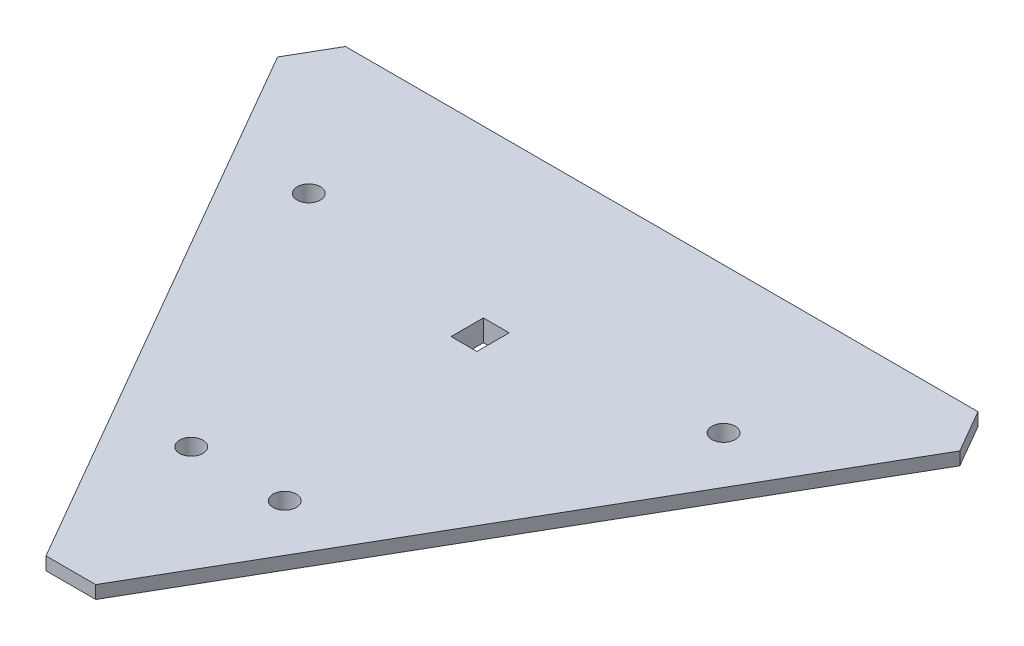
ISO-10303-21;
HEADER;
FILE_DESCRIPTION(('STEP AP214'),'2;1');
FILE_NAME('part.step','',(''),(''),'','','');
FILE_SCHEMA(('AUTOMOTIVE_DESIGN { 1 0 10303 214 1 1 1 1 }'));
ENDSEC;
DATA;
#1=APPLICATION_CONTEXT('core data for automotive mechanical design processes');
#2=APPLICATION_PROTOCOL_DEFINITION('international standard','automotive_design',2000,#1);
#3=PRODUCT_CONTEXT('',#1,'mechanical');
#4=PRODUCT('Part','Part','',(#3));
#5=PRODUCT_RELATED_PRODUCT_CATEGORY('part','',(#4));
#6=PRODUCT_DEFINITION_FORMATION('','',#4);
#7=PRODUCT_DEFINITION_CONTEXT('part definition',#1,'design');
#8=PRODUCT_DEFINITION('design','',#6,#7);
#9=PRODUCT_DEFINITION_SHAPE('','',#8);
#10=(LENGTH_UNIT() NAMED_UNIT(*) SI_UNIT(.MILLI.,.METRE.));
#11=(NAMED_UNIT(*) PLANE_ANGLE_UNIT() SI_UNIT($,.RADIAN.));
#12=(NAMED_UNIT(*) SI_UNIT($,.STERADIAN.) SOLID_ANGLE_UNIT());
#13=UNCERTAINTY_MEASURE_WITH_UNIT(LENGTH_MEASURE(1.E-05),#10,'distance_accuracy_value','');
#14=(GEOMETRIC_REPRESENTATION_CONTEXT(3) GLOBAL_UNCERTAINTY_ASSIGNED_CONTEXT((#13)) GLOBAL_UNIT_ASSIGNED_CONTEXT((#10,
#11,#12)) REPRESENTATION_CONTEXT('',''));
#15=CARTESIAN_POINT('',(0.,0.,0.));
#16=DIRECTION('',(0.,0.,1.));
#17=DIRECTION('',(1.,0.,0.));
#18=AXIS2_PLACEMENT_3D('',#15,#16,#17);
#19=CARTESIAN_POINT('',(0.,0.,0.));
#20=DIRECTION('',(0.,1.,0.));
#21=DIRECTION('',(0.,0.,1.));
#22=AXIS2_PLACEMENT_3D('',#19,#20,#21);
#23=PLANE('',#22);
#24=DIRECTION('',(-1.,0.,0.));
#25=VECTOR('',#24,1.);
#26=CARTESIAN_POINT('',(3.15,0.,-3.));
#27=LINE('',#26,#25);
#28=CARTESIAN_POINT('',(3.15,0.,-3.));
#29=VERTEX_POINT('',#28);
#30=CARTESIAN_POINT('',(-2.85,0.,-3.));
#31=VERTEX_POINT('',#30);
#32=EDGE_CURVE('E185',#29,#31,#27,.T.);
#33=ORIENTED_EDGE('',*,*,#32,.F.);
#34=DIRECTION('',(0.,0.,1.));
#35=VECTOR('',#34,1.);
#36=CARTESIAN_POINT('',(3.15,0.,-10.5));
#37=LINE('',#36,#35);
#38=CARTESIAN_POINT('',(3.15,0.,-10.5));
#39=VERTEX_POINT('',#38);
#40=EDGE_CURVE('E52',#39,#29,#37,.T.);
#41=ORIENTED_EDGE('',*,*,#40,.F.);
#42=DIRECTION('',(1.,0.,0.));
#43=VECTOR('',#42,1.);
#44=CARTESIAN_POINT('',(3.15,0.,-10.5));
#45=LINE('',#44,#43);
#46=CARTESIAN_POINT('',(-2.85,0.,-10.5));
#47=VERTEX_POINT('',#46);
#48=EDGE_CURVE('E191',#47,#39,#45,.T.);
#49=ORIENTED_EDGE('',*,*,#48,.F.);
#50=DIRECTION('',(0.,0.,-1.));
#51=VECTOR('',#50,1.);
#52=CARTESIAN_POINT('',(-2.85,0.,-10.5));
#53=LINE('',#52,#51);
#54=EDGE_CURVE('E176',#31,#47,#53,.T.);
#55=ORIENTED_EDGE('',*,*,#54,.F.);
#56=EDGE_LOOP('',(#33,#41,#49,#55));
#57=FACE_BOUND('',#56,.T.);
#58=DIRECTION('',(-1.,0.,0.));
#59=VECTOR('',#58,1.);
#60=CARTESIAN_POINT('',(8.,0.,0.));
#61=LINE('',#60,#59);
#62=CARTESIAN_POINT('',(8.,0.,0.));
#63=VERTEX_POINT('',#62);
#64=CARTESIAN_POINT('',(-8.,0.,0.));
#65=VERTEX_POINT('',#64);
#66=EDGE_CURVE('E216',#63,#65,#61,.T.);
#67=ORIENTED_EDGE('',*,*,#66,.F.);
#68=DIRECTION('',(0.,0.,1.));
#69=VECTOR('',#68,1.);
#70=CARTESIAN_POINT('',(8.,0.,-2.));
#71=LINE('',#70,#69);
#72=CARTESIAN_POINT('',(8.,0.,-2.));
#73=VERTEX_POINT('',#72);
#74=EDGE_CURVE('E198',#73,#63,#71,.T.);
#75=ORIENTED_EDGE('',*,*,#74,.F.);
#76=DIRECTION('',(1.,0.,0.));
#77=VECTOR('',#76,1.);
#78=CARTESIAN_POINT('',(8.,0.,-2.));
#79=LINE('',#78,#77);
#80=CARTESIAN_POINT('',(-8.,0.,-2.));
#81=VERTEX_POINT('',#80);
#82=EDGE_CURVE('E205',#81,#73,#79,.T.);
#83=ORIENTED_EDGE('',*,*,#82,.F.);
#84=DIRECTION('',(0.,0.,-1.));
#85=VECTOR('',#84,1.);
#86=CARTESIAN_POINT('',(-8.,0.,-2.));
#87=LINE('',#86,#85);
#88=EDGE_CURVE('E219',#65,#81,#87,.T.);
#89=ORIENTED_EDGE('',*,*,#88,.F.);
#90=EDGE_LOOP('',(#67,#75,#83,#89));
#91=FACE_BOUND('',#90,.T.);
#92=CARTESIAN_POINT('',(48.1611389078098,0.,-15.2679937764724));
#93=DIRECTION('',(0.,-1.,0.));
#94=DIRECTION('',(0.,0.,-1.));
#95=AXIS2_PLACEMENT_3D('',#92,#93,#94);
#96=CIRCLE('',#95,2.7);
#97=CARTESIAN_POINT('',(48.1611389078098,0.,-17.9679937764724));
#98=VERTEX_POINT('',#97);
#99=EDGE_CURVE('E237',#98,#98,#96,.T.);
#100=ORIENTED_EDGE('',*,*,#99,.F.);
#101=EDGE_LOOP('',(#100));
#102=FACE_BOUND('',#101,.T.);
#103=CARTESIAN_POINT('',(10.8580989786571,0.,49.3427666575906));
#104=DIRECTION('',(0.,-1.,0.));
#105=DIRECTION('',(0.,0.,-1.));
#106=AXIS2_PLACEMENT_3D('',#103,#104,#105);
#107=CIRCLE('',#106,2.7);
#108=CARTESIAN_POINT('',(10.8580989786571,0.,46.6427666575906));
#109=VERTEX_POINT('',#108);
#110=EDGE_CURVE('E252',#109,#109,#107,.T.);
#111=ORIENTED_EDGE('',*,*,#110,.F.);
#112=EDGE_LOOP('',(#111));
#113=FACE_BOUND('',#112,.T.);
#114=DIRECTION('',(-0.500000000000004,0.,-0.866025403784436));
#115=VECTOR('',#114,1.);
#116=CARTESIAN_POINT('',(-39.7999999999998,0.,22.9785407137472));
#117=LINE('',#116,#115);
#118=CARTESIAN_POINT('',(-9.79999999999968,0.,74.9400649408132));
#119=VERTEX_POINT('',#118);
#120=CARTESIAN_POINT('',(-69.8000000000002,0.,-28.9829835133192));
#121=VERTEX_POINT('',#120);
#122=EDGE_CURVE('E301',#119,#121,#117,.T.);
#123=ORIENTED_EDGE('',*,*,#122,.T.);
#124=DIRECTION('',(-0.500000000000004,0.,0.866025403784436));
#125=VECTOR('',#124,1.);
#126=CARTESIAN_POINT('',(-64.8999999999999,0.,-37.4700324704071));
#127=LINE('',#126,#125);
#128=CARTESIAN_POINT('',(-60.0000000000001,0.,-45.9570814274941));
#129=VERTEX_POINT('',#128);
#130=EDGE_CURVE('E305',#129,#121,#127,.T.);
#131=ORIENTED_EDGE('',*,*,#130,.F.);
#132=DIRECTION('',(1.,0.,0.));
#133=VECTOR('',#132,1.);
#134=CARTESIAN_POINT('',(0.,0.,-45.9570814274941));
#135=LINE('',#134,#133);
#136=CARTESIAN_POINT('',(59.9999999999999,0.,-45.9570814274941));
#137=VERTEX_POINT('',#136);
#138=EDGE_CURVE('E331',#129,#137,#135,.T.);
#139=ORIENTED_EDGE('',*,*,#138,.T.);
#140=DIRECTION('',(0.500000000000025,0.,0.866025403784424));
#141=VECTOR('',#140,1.);
#142=CARTESIAN_POINT('',(64.8999999999991,0.,-37.4700324704086));
#143=LINE('',#142,#141);
#144=CARTESIAN_POINT('',(69.8,0.,-28.98298351332));
#145=VERTEX_POINT('',#144);
#146=EDGE_CURVE('E328',#137,#145,#143,.T.);
#147=ORIENTED_EDGE('',*,*,#146,.T.);
#148=DIRECTION('',(0.499999999999996,0.,-0.866025403784441));
#149=VECTOR('',#148,1.);
#150=CARTESIAN_POINT('',(39.8,0.,22.9785407137469));
#151=LINE('',#150,#149);
#152=CARTESIAN_POINT('',(9.80000000000033,0.,74.9400649408132));
#153=VERTEX_POINT('',#152);
#154=EDGE_CURVE('E325',#153,#145,#151,.T.);
#155=ORIENTED_EDGE('',*,*,#154,.F.);
#156=DIRECTION('',(1.,0.,0.));
#157=VECTOR('',#156,1.);
#158=CARTESIAN_POINT('',(0.,0.,74.9400649408132));
#159=LINE('',#158,#157);
#160=EDGE_CURVE('E323',#119,#153,#159,.T.);
#161=ORIENTED_EDGE('',*,*,#160,.F.);
#162=EDGE_LOOP('',(#123,#131,#139,#147,#155,#161));
#163=FACE_BOUND('',#162,.T.);
#164=CARTESIAN_POINT('',(-10.8580989786571,0.,49.3427666575906));
#165=DIRECTION('',(0.,1.,0.));
#166=DIRECTION('',(0.,0.,1.));
#167=AXIS2_PLACEMENT_3D('',#164,#165,#166);
#168=CIRCLE('',#167,2.7);
#169=CARTESIAN_POINT('',(-10.8580989786571,0.,52.0427666575906));
#170=VERTEX_POINT('',#169);
#171=EDGE_CURVE('E246',#170,#170,#168,.T.);
#172=ORIENTED_EDGE('',*,*,#171,.T.);
#173=EDGE_LOOP('',(#172));
#174=FACE_BOUND('',#173,.T.);
#175=CARTESIAN_POINT('',(-48.1611389078098,0.,-15.2679937764724));
#176=DIRECTION('',(0.,1.,0.));
#177=DIRECTION('',(0.,0.,1.));
#178=AXIS2_PLACEMENT_3D('',#175,#176,#177);
#179=CIRCLE('',#178,2.7);
#180=CARTESIAN_POINT('',(-48.1611389078098,0.,-12.5679937764724));
#181=VERTEX_POINT('',#180);
#182=EDGE_CURVE('E240',#181,#181,#179,.T.);
#183=ORIENTED_EDGE('',*,*,#182,.T.);
#184=EDGE_LOOP('',(#183));
#185=FACE_BOUND('',#184,.T.);
#186=ADVANCED_FACE('F37',(#57,#91,#102,#113,#163,#174,#185),#23,.F.);
#187=CARTESIAN_POINT('',(0.,5.,0.));
#188=DIRECTION('',(0.,1.,0.));
#189=DIRECTION('',(0.,0.,1.));
#190=AXIS2_PLACEMENT_3D('',#187,#188,#189);
#191=PLANE('',#190);
#192=DIRECTION('',(0.,0.,-1.));
#193=VECTOR('',#192,1.);
#194=CARTESIAN_POINT('',(3.15,5.,0.));
#195=LINE('',#194,#193);
#196=CARTESIAN_POINT('',(3.15,5.,-3.));
#197=VERTEX_POINT('',#196);
#198=CARTESIAN_POINT('',(3.15,5.,-10.5));
#199=VERTEX_POINT('',#198);
#200=EDGE_CURVE('E11',#197,#199,#195,.T.);
#201=ORIENTED_EDGE('',*,*,#200,.F.);
#202=DIRECTION('',(1.,0.,0.));
#203=VECTOR('',#202,1.);
#204=CARTESIAN_POINT('',(0.,5.,-3.));
#205=LINE('',#204,#203);
#206=CARTESIAN_POINT('',(-2.85,5.,-3.));
#207=VERTEX_POINT('',#206);
#208=EDGE_CURVE('E348',#207,#197,#205,.T.);
#209=ORIENTED_EDGE('',*,*,#208,.F.);
#210=DIRECTION('',(0.,0.,1.));
#211=VECTOR('',#210,1.);
#212=CARTESIAN_POINT('',(-2.85,5.,0.));
#213=LINE('',#212,#211);
#214=CARTESIAN_POINT('',(-2.85,5.,-10.5));
#215=VERTEX_POINT('',#214);
#216=EDGE_CURVE('E179',#215,#207,#213,.T.);
#217=ORIENTED_EDGE('',*,*,#216,.F.);
#218=DIRECTION('',(-1.,0.,0.));
#219=VECTOR('',#218,1.);
#220=CARTESIAN_POINT('',(0.,5.,-10.5));
#221=LINE('',#220,#219);
#222=EDGE_CURVE('E45',#199,#215,#221,.T.);
#223=ORIENTED_EDGE('',*,*,#222,.F.);
#224=EDGE_LOOP('',(#201,#209,#217,#223));
#225=FACE_BOUND('',#224,.T.);
#226=CARTESIAN_POINT('',(48.1611389078098,5.,-15.2679937764724));
#227=DIRECTION('',(0.,-1.,0.));
#228=DIRECTION('',(0.,0.,-1.));
#229=AXIS2_PLACEMENT_3D('',#226,#227,#228);
#230=CIRCLE('',#229,2.7);
#231=CARTESIAN_POINT('',(48.1611389078098,5.,-17.9679937764724));
#232=VERTEX_POINT('',#231);
#233=EDGE_CURVE('E233',#232,#232,#230,.T.);
#234=ORIENTED_EDGE('',*,*,#233,.T.);
#235=EDGE_LOOP('',(#234));
#236=FACE_BOUND('',#235,.T.);
#237=CARTESIAN_POINT('',(-10.8580989786571,5.,49.3427666575906));
#238=DIRECTION('',(0.,1.,0.));
#239=DIRECTION('',(0.,0.,1.));
#240=AXIS2_PLACEMENT_3D('',#237,#238,#239);
#241=CIRCLE('',#240,2.7);
#242=CARTESIAN_POINT('',(-10.8580989786571,5.,52.0427666575906));
#243=VERTEX_POINT('',#242);
#244=EDGE_CURVE('E249',#243,#243,#241,.T.);
#245=ORIENTED_EDGE('',*,*,#244,.F.);
#246=EDGE_LOOP('',(#245));
#247=FACE_BOUND('',#246,.T.);
#248=CARTESIAN_POINT('',(10.8580989786571,5.,49.3427666575906));
#249=DIRECTION('',(0.,-1.,0.));
#250=DIRECTION('',(0.,0.,-1.));
#251=AXIS2_PLACEMENT_3D('',#248,#249,#250);
#252=CIRCLE('',#251,2.7);
#253=CARTESIAN_POINT('',(10.8580989786571,5.,46.6427666575906));
#254=VERTEX_POINT('',#253);
#255=EDGE_CURVE('E226',#254,#254,#252,.T.);
#256=ORIENTED_EDGE('',*,*,#255,.T.);
#257=EDGE_LOOP('',(#256));
#258=FACE_BOUND('',#257,.T.);
#259=DIRECTION('',(-0.499999999999999,0.,0.866025403784439));
#260=VECTOR('',#259,1.);
#261=CARTESIAN_POINT('',(-73.4529946162049,5.,-49.0747728811169));
#262=LINE('',#261,#260);
#263=CARTESIAN_POINT('',(-73.4529946162049,5.,-49.0747728811169));
#264=VERTEX_POINT('',#263);
#265=CARTESIAN_POINT('',(-79.2264973081012,5.,-39.0747728811169));
#266=VERTEX_POINT('',#265);
#267=EDGE_CURVE('E257',#264,#266,#262,.T.);
#268=ORIENTED_EDGE('',*,*,#267,.T.);
#269=DIRECTION('',(0.499999999999998,0.,0.86602540378444));
#270=VECTOR('',#269,1.);
#271=CARTESIAN_POINT('',(-79.2264973081012,5.,-39.0747728811169));
#272=LINE('',#271,#270);
#273=CARTESIAN_POINT('',(-5.77350269189443,5.,88.149545762237));
#274=VERTEX_POINT('',#273);
#275=EDGE_CURVE('E260',#266,#274,#272,.T.);
#276=ORIENTED_EDGE('',*,*,#275,.T.);
#277=DIRECTION('',(1.,0.,0.));
#278=VECTOR('',#277,1.);
#279=CARTESIAN_POINT('',(-5.77350269189443,5.,88.149545762237));
#280=LINE('',#279,#278);
#281=CARTESIAN_POINT('',(5.77350269189499,5.,88.1495457622376));
#282=VERTEX_POINT('',#281);
#283=EDGE_CURVE('E263',#274,#282,#280,.T.);
#284=ORIENTED_EDGE('',*,*,#283,.T.);
#285=DIRECTION('',(0.499999999999995,0.,-0.866025403784441));
#286=VECTOR('',#285,1.);
#287=CARTESIAN_POINT('',(5.77350269189499,5.,88.1495457622376));
#288=LINE('',#287,#286);
#289=CARTESIAN_POINT('',(79.226497308102,5.,-39.0747728811178));
#290=VERTEX_POINT('',#289);
#291=EDGE_CURVE('E265',#282,#290,#288,.T.);
#292=ORIENTED_EDGE('',*,*,#291,.T.);
#293=DIRECTION('',(0.499999999999975,0.,0.866025403784453));
#294=VECTOR('',#293,1.);
#295=CARTESIAN_POINT('',(73.4529946162064,5.,-49.0747728811173));
#296=LINE('',#295,#294);
#297=CARTESIAN_POINT('',(73.4529946162064,5.,-49.0747728811173));
#298=VERTEX_POINT('',#297);
#299=EDGE_CURVE('E267',#298,#290,#296,.T.);
#300=ORIENTED_EDGE('',*,*,#299,.F.);
#301=DIRECTION('',(-1.,0.,0.));
#302=VECTOR('',#301,1.);
#303=CARTESIAN_POINT('',(73.4529946162064,5.,-49.0747728811173));
#304=LINE('',#303,#302);
#305=EDGE_CURVE('E270',#298,#264,#304,.T.);
#306=ORIENTED_EDGE('',*,*,#305,.T.);
#307=EDGE_LOOP('',(#268,#276,#284,#292,#300,#306));
#308=FACE_BOUND('',#307,.T.);
#309=CARTESIAN_POINT('',(-48.1611389078098,5.,-15.2679937764724));
#310=DIRECTION('',(0.,1.,0.));
#311=DIRECTION('',(0.,0.,1.));
#312=AXIS2_PLACEMENT_3D('',#309,#310,#311);
#313=CIRCLE('',#312,2.7);
#314=CARTESIAN_POINT('',(-48.1611389078098,5.,-12.5679937764724));
#315=VERTEX_POINT('',#314);
#316=EDGE_CURVE('E243',#315,#315,#313,.T.);
#317=ORIENTED_EDGE('',*,*,#316,.F.);
#318=EDGE_LOOP('',(#317));
#319=FACE_BOUND('',#318,.T.);
#320=ADVANCED_FACE('F356',(#225,#236,#247,#258,#308,#319),#191,.T.);
#321=CARTESIAN_POINT('',(-39.7999999999998,2.,22.9785407137472));
#322=DIRECTION('',(-0.866025403784436,0.,0.500000000000004));
#323=DIRECTION('',(0.500000000000004,0.,0.866025403784436));
#324=AXIS2_PLACEMENT_3D('',#321,#322,#323);
#325=PLANE('',#324);
#326=ORIENTED_EDGE('',*,*,#122,.F.);
#327=DIRECTION('',(0.,-1.,0.));
#328=VECTOR('',#327,1.);
#329=CARTESIAN_POINT('',(-9.79999999999968,2.,74.9400649408132));
#330=LINE('',#329,#328);
#331=CARTESIAN_POINT('',(-9.79999999999968,2.,74.9400649408132));
#332=VERTEX_POINT('',#331);
#333=EDGE_CURVE('E346',#332,#119,#330,.T.);
#334=ORIENTED_EDGE('',*,*,#333,.F.);
#335=DIRECTION('',(-0.500000000000004,0.,-0.866025403784436));
#336=VECTOR('',#335,1.);
#337=CARTESIAN_POINT('',(-39.7999999999998,2.,22.9785407137472));
#338=LINE('',#337,#336);
#339=CARTESIAN_POINT('',(-69.8000000000002,2.,-28.9829835133192));
#340=VERTEX_POINT('',#339);
#341=EDGE_CURVE('E302',#332,#340,#338,.T.);
#342=ORIENTED_EDGE('',*,*,#341,.T.);
#343=DIRECTION('',(0.,-1.,0.));
#344=VECTOR('',#343,1.);
#345=CARTESIAN_POINT('',(-69.8000000000002,2.,-28.9829835133192));
#346=LINE('',#345,#344);
#347=EDGE_CURVE('E320',#340,#121,#346,.T.);
#348=ORIENTED_EDGE('',*,*,#347,.T.);
#349=EDGE_LOOP('',(#326,#334,#342,#348));
#350=FACE_BOUND('',#349,.T.);
#351=ADVANCED_FACE('F39',(#350),#325,.T.);
#352=CARTESIAN_POINT('',(0.,2.,74.9400649408132));
#353=DIRECTION('',(0.,0.,-1.));
#354=DIRECTION('',(-1.,0.,0.));
#355=AXIS2_PLACEMENT_3D('',#352,#353,#354);
#356=PLANE('',#355);
#357=ORIENTED_EDGE('',*,*,#160,.T.);
#358=DIRECTION('',(0.,-1.,0.));
#359=VECTOR('',#358,1.);
#360=CARTESIAN_POINT('',(9.80000000000033,2.,74.9400649408132));
#361=LINE('',#360,#359);
#362=CARTESIAN_POINT('',(9.80000000000033,2.,74.9400649408132));
#363=VERTEX_POINT('',#362);
#364=EDGE_CURVE('E343',#363,#153,#361,.T.);
#365=ORIENTED_EDGE('',*,*,#364,.F.);
#366=DIRECTION('',(1.,0.,0.));
#367=VECTOR('',#366,1.);
#368=CARTESIAN_POINT('',(0.,2.,74.9400649408132));
#369=LINE('',#368,#367);
#370=EDGE_CURVE('E304',#332,#363,#369,.T.);
#371=ORIENTED_EDGE('',*,*,#370,.F.);
#372=ORIENTED_EDGE('',*,*,#333,.T.);
#373=EDGE_LOOP('',(#357,#365,#371,#372));
#374=FACE_BOUND('',#373,.T.);
#375=ADVANCED_FACE('F395',(#374),#356,.F.);
#376=CARTESIAN_POINT('',(39.8,2.,22.9785407137469));
#377=DIRECTION('',(-0.866025403784441,0.,-0.499999999999996));
#378=DIRECTION('',(-0.499999999999996,0.,0.866025403784441));
#379=AXIS2_PLACEMENT_3D('',#376,#377,#378);
#380=PLANE('',#379);
#381=ORIENTED_EDGE('',*,*,#154,.T.);
#382=DIRECTION('',(0.,-1.,0.));
#383=VECTOR('',#382,1.);
#384=CARTESIAN_POINT('',(69.8,2.,-28.98298351332));
#385=LINE('',#384,#383);
#386=CARTESIAN_POINT('',(69.8,2.,-28.98298351332));
#387=VERTEX_POINT('',#386);
#388=EDGE_CURVE('E341',#387,#145,#385,.T.);
#389=ORIENTED_EDGE('',*,*,#388,.F.);
#390=DIRECTION('',(0.499999999999996,0.,-0.866025403784441));
#391=VECTOR('',#390,1.);
#392=CARTESIAN_POINT('',(39.8,2.,22.9785407137469));
#393=LINE('',#392,#391);
#394=EDGE_CURVE('E308',#363,#387,#393,.T.);
#395=ORIENTED_EDGE('',*,*,#394,.F.);
#396=ORIENTED_EDGE('',*,*,#364,.T.);
#397=EDGE_LOOP('',(#381,#389,#395,#396));
#398=FACE_BOUND('',#397,.T.);
#399=ADVANCED_FACE('F392',(#398),#380,.F.);
#400=CARTESIAN_POINT('',(64.8999999999991,2.,-37.4700324704086));
#401=DIRECTION('',(0.866025403784424,0.,-0.500000000000025));
#402=DIRECTION('',(-0.500000000000025,0.,-0.866025403784424));
#403=AXIS2_PLACEMENT_3D('',#400,#401,#402);
#404=PLANE('',#403);
#405=ORIENTED_EDGE('',*,*,#146,.F.);
#406=DIRECTION('',(0.,-1.,0.));
#407=VECTOR('',#406,1.);
#408=CARTESIAN_POINT('',(59.9999999999999,2.,-45.9570814274941));
#409=LINE('',#408,#407);
#410=CARTESIAN_POINT('',(59.9999999999999,2.,-45.9570814274941));
#411=VERTEX_POINT('',#410);
#412=EDGE_CURVE('E339',#411,#137,#409,.T.);
#413=ORIENTED_EDGE('',*,*,#412,.F.);
#414=DIRECTION('',(0.500000000000025,0.,0.866025403784424));
#415=VECTOR('',#414,1.);
#416=CARTESIAN_POINT('',(64.8999999999991,2.,-37.4700324704086));
#417=LINE('',#416,#415);
#418=EDGE_CURVE('E311',#411,#387,#417,.T.);
#419=ORIENTED_EDGE('',*,*,#418,.T.);
#420=ORIENTED_EDGE('',*,*,#388,.T.);
#421=EDGE_LOOP('',(#405,#413,#419,#420));
#422=FACE_BOUND('',#421,.T.);
#423=ADVANCED_FACE('F388',(#422),#404,.T.);
#424=CARTESIAN_POINT('',(0.,2.,-45.9570814274941));
#425=DIRECTION('',(0.,0.,-1.));
#426=DIRECTION('',(-1.,0.,0.));
#427=AXIS2_PLACEMENT_3D('',#424,#425,#426);
#428=PLANE('',#427);
#429=ORIENTED_EDGE('',*,*,#138,.F.);
#430=DIRECTION('',(0.,-1.,0.));
#431=VECTOR('',#430,1.);
#432=CARTESIAN_POINT('',(-60.0000000000001,2.,-45.9570814274941));
#433=LINE('',#432,#431);
#434=CARTESIAN_POINT('',(-60.0000000000001,2.,-45.9570814274941));
#435=VERTEX_POINT('',#434);
#436=EDGE_CURVE('E337',#435,#129,#433,.T.);
#437=ORIENTED_EDGE('',*,*,#436,.F.);
#438=DIRECTION('',(1.,0.,0.));
#439=VECTOR('',#438,1.);
#440=CARTESIAN_POINT('',(0.,2.,-45.9570814274941));
#441=LINE('',#440,#439);
#442=EDGE_CURVE('E314',#435,#411,#441,.T.);
#443=ORIENTED_EDGE('',*,*,#442,.T.);
#444=ORIENTED_EDGE('',*,*,#412,.T.);
#445=EDGE_LOOP('',(#429,#437,#443,#444));
#446=FACE_BOUND('',#445,.T.);
#447=ADVANCED_FACE('F384',(#446),#428,.T.);
#448=CARTESIAN_POINT('',(-64.8999999999999,2.,-37.4700324704071));
#449=DIRECTION('',(0.866025403784436,0.,0.500000000000004));
#450=DIRECTION('',(0.500000000000004,0.,-0.866025403784436));
#451=AXIS2_PLACEMENT_3D('',#448,#449,#450);
#452=PLANE('',#451);
#453=ORIENTED_EDGE('',*,*,#130,.T.);
#454=ORIENTED_EDGE('',*,*,#347,.F.);
#455=DIRECTION('',(-0.500000000000004,0.,0.866025403784436));
#456=VECTOR('',#455,1.);
#457=CARTESIAN_POINT('',(-64.8999999999999,2.,-37.4700324704071));
#458=LINE('',#457,#456);
#459=EDGE_CURVE('E317',#435,#340,#458,.T.);
#460=ORIENTED_EDGE('',*,*,#459,.F.);
#461=ORIENTED_EDGE('',*,*,#436,.T.);
#462=EDGE_LOOP('',(#453,#454,#460,#461));
#463=FACE_BOUND('',#462,.T.);
#464=ADVANCED_FACE('F381',(#463),#452,.F.);
#465=CARTESIAN_POINT('',(-73.4529946162049,5.,-49.0747728811169));
#466=DIRECTION('',(0.866025403784439,0.,0.499999999999999));
#467=DIRECTION('',(0.499999999999999,0.,-0.866025403784439));
#468=AXIS2_PLACEMENT_3D('',#465,#466,#467);
#469=PLANE('',#468);
#470=DIRECTION('',(-0.499999999999999,0.,0.866025403784439));
#471=VECTOR('',#470,1.);
#472=CARTESIAN_POINT('',(-73.4529946162049,2.,-49.0747728811169));
#473=LINE('',#472,#471);
#474=CARTESIAN_POINT('',(-73.4529946162049,2.,-49.0747728811169));
#475=VERTEX_POINT('',#474);
#476=CARTESIAN_POINT('',(-79.2264973081012,2.,-39.0747728811169));
#477=VERTEX_POINT('',#476);
#478=EDGE_CURVE('E236',#475,#477,#473,.T.);
#479=ORIENTED_EDGE('',*,*,#478,.T.);
#480=DIRECTION('',(0.,-1.,0.));
#481=VECTOR('',#480,1.);
#482=CARTESIAN_POINT('',(-79.2264973081012,5.,-39.0747728811169));
#483=LINE('',#482,#481);
#484=EDGE_CURVE('E298',#266,#477,#483,.T.);
#485=ORIENTED_EDGE('',*,*,#484,.F.);
#486=ORIENTED_EDGE('',*,*,#267,.F.);
#487=DIRECTION('',(0.,-1.,0.));
#488=VECTOR('',#487,1.);
#489=CARTESIAN_POINT('',(-73.4529946162049,5.,-49.0747728811169));
#490=LINE('',#489,#488);
#491=EDGE_CURVE('E272',#264,#475,#490,.T.);
#492=ORIENTED_EDGE('',*,*,#491,.T.);
#493=EDGE_LOOP('',(#479,#485,#486,#492));
#494=FACE_BOUND('',#493,.T.);
#495=ADVANCED_FACE('F379',(#494),#469,.F.);
#496=CARTESIAN_POINT('',(-79.2264973081012,5.,-39.0747728811169));
#497=DIRECTION('',(0.86602540378444,0.,-0.499999999999998));
#498=DIRECTION('',(-0.499999999999998,0.,-0.86602540378444));
#499=AXIS2_PLACEMENT_3D('',#496,#497,#498);
#500=PLANE('',#499);
#501=DIRECTION('',(0.499999999999998,0.,0.86602540378444));
#502=VECTOR('',#501,1.);
#503=CARTESIAN_POINT('',(-79.2264973081012,2.,-39.0747728811169));
#504=LINE('',#503,#502);
#505=CARTESIAN_POINT('',(-5.77350269189443,2.,88.149545762237));
#506=VERTEX_POINT('',#505);
#507=EDGE_CURVE('E275',#477,#506,#504,.T.);
#508=ORIENTED_EDGE('',*,*,#507,.T.);
#509=DIRECTION('',(0.,-1.,0.));
#510=VECTOR('',#509,1.);
#511=CARTESIAN_POINT('',(-5.77350269189443,5.,88.149545762237));
#512=LINE('',#511,#510);
#513=EDGE_CURVE('E295',#274,#506,#512,.T.);
#514=ORIENTED_EDGE('',*,*,#513,.F.);
#515=ORIENTED_EDGE('',*,*,#275,.F.);
#516=ORIENTED_EDGE('',*,*,#484,.T.);
#517=EDGE_LOOP('',(#508,#514,#515,#516));
#518=FACE_BOUND('',#517,.T.);
#519=ADVANCED_FACE('F449',(#518),#500,.F.);
#520=CARTESIAN_POINT('',(-5.77350269189443,5.,88.149545762237));
#521=DIRECTION('',(0.,0.,-1.));
#522=DIRECTION('',(-1.,0.,0.));
#523=AXIS2_PLACEMENT_3D('',#520,#521,#522);
#524=PLANE('',#523);
#525=DIRECTION('',(1.,0.,0.));
#526=VECTOR('',#525,1.);
#527=CARTESIAN_POINT('',(-5.77350269189443,2.,88.149545762237));
#528=LINE('',#527,#526);
#529=CARTESIAN_POINT('',(5.77350269189499,2.,88.1495457622376));
#530=VERTEX_POINT('',#529);
#531=EDGE_CURVE('E277',#506,#530,#528,.T.);
#532=ORIENTED_EDGE('',*,*,#531,.T.);
#533=DIRECTION('',(0.,-1.,0.));
#534=VECTOR('',#533,1.);
#535=CARTESIAN_POINT('',(5.77350269189499,5.,88.1495457622376));
#536=LINE('',#535,#534);
#537=EDGE_CURVE('E292',#282,#530,#536,.T.);
#538=ORIENTED_EDGE('',*,*,#537,.F.);
#539=ORIENTED_EDGE('',*,*,#283,.F.);
#540=ORIENTED_EDGE('',*,*,#513,.T.);
#541=EDGE_LOOP('',(#532,#538,#539,#540));
#542=FACE_BOUND('',#541,.T.);
#543=ADVANCED_FACE('F446',(#542),#524,.F.);
#544=CARTESIAN_POINT('',(5.77350269189499,5.,88.1495457622376));
#545=DIRECTION('',(-0.866025403784441,0.,-0.499999999999995));
#546=DIRECTION('',(-0.499999999999995,0.,0.866025403784441));
#547=AXIS2_PLACEMENT_3D('',#544,#545,#546);
#548=PLANE('',#547);
#549=DIRECTION('',(0.499999999999995,0.,-0.866025403784441));
#550=VECTOR('',#549,1.);
#551=CARTESIAN_POINT('',(5.77350269189499,2.,88.1495457622376));
#552=LINE('',#551,#550);
#553=CARTESIAN_POINT('',(79.226497308102,2.,-39.0747728811178));
#554=VERTEX_POINT('',#553);
#555=EDGE_CURVE('E279',#530,#554,#552,.T.);
#556=ORIENTED_EDGE('',*,*,#555,.T.);
#557=DIRECTION('',(0.,-1.,0.));
#558=VECTOR('',#557,1.);
#559=CARTESIAN_POINT('',(79.226497308102,5.,-39.0747728811178));
#560=LINE('',#559,#558);
#561=EDGE_CURVE('E290',#290,#554,#560,.T.);
#562=ORIENTED_EDGE('',*,*,#561,.F.);
#563=ORIENTED_EDGE('',*,*,#291,.F.);
#564=ORIENTED_EDGE('',*,*,#537,.T.);
#565=EDGE_LOOP('',(#556,#562,#563,#564));
#566=FACE_BOUND('',#565,.T.);
#567=ADVANCED_FACE('F441',(#566),#548,.F.);
#568=CARTESIAN_POINT('',(73.4529946162064,5.,-49.0747728811173));
#569=DIRECTION('',(0.866025403784453,0.,-0.499999999999975));
#570=DIRECTION('',(-0.499999999999975,0.,-0.866025403784453));
#571=AXIS2_PLACEMENT_3D('',#568,#569,#570);
#572=PLANE('',#571);
#573=DIRECTION('',(0.499999999999975,0.,0.866025403784453));
#574=VECTOR('',#573,1.);
#575=CARTESIAN_POINT('',(73.4529946162064,2.,-49.0747728811173));
#576=LINE('',#575,#574);
#577=CARTESIAN_POINT('',(73.4529946162064,2.,-49.0747728811173));
#578=VERTEX_POINT('',#577);
#579=EDGE_CURVE('E282',#578,#554,#576,.T.);
#580=ORIENTED_EDGE('',*,*,#579,.F.);
#581=DIRECTION('',(0.,-1.,0.));
#582=VECTOR('',#581,1.);
#583=CARTESIAN_POINT('',(73.4529946162064,5.,-49.0747728811173));
#584=LINE('',#583,#582);
#585=EDGE_CURVE('E288',#298,#578,#584,.T.);
#586=ORIENTED_EDGE('',*,*,#585,.F.);
#587=ORIENTED_EDGE('',*,*,#299,.T.);
#588=ORIENTED_EDGE('',*,*,#561,.T.);
#589=EDGE_LOOP('',(#580,#586,#587,#588));
#590=FACE_BOUND('',#589,.T.);
#591=ADVANCED_FACE('F437',(#590),#572,.T.);
#592=CARTESIAN_POINT('',(73.4529946162064,5.,-49.0747728811173));
#593=DIRECTION('',(0.,0.,1.));
#594=DIRECTION('',(1.,0.,0.));
#595=AXIS2_PLACEMENT_3D('',#592,#593,#594);
#596=PLANE('',#595);
#597=DIRECTION('',(-1.,0.,0.));
#598=VECTOR('',#597,1.);
#599=CARTESIAN_POINT('',(73.4529946162064,2.,-49.0747728811173));
#600=LINE('',#599,#598);
#601=EDGE_CURVE('E261',#578,#475,#600,.T.);
#602=ORIENTED_EDGE('',*,*,#601,.T.);
#603=ORIENTED_EDGE('',*,*,#491,.F.);
#604=ORIENTED_EDGE('',*,*,#305,.F.);
#605=ORIENTED_EDGE('',*,*,#585,.T.);
#606=EDGE_LOOP('',(#602,#603,#604,#605));
#607=FACE_BOUND('',#606,.T.);
#608=ADVANCED_FACE('F423',(#607),#596,.F.);
#609=CARTESIAN_POINT('',(0.,2.,0.));
#610=DIRECTION('',(0.,1.,0.));
#611=DIRECTION('',(0.,0.,1.));
#612=AXIS2_PLACEMENT_3D('',#609,#610,#611);
#613=PLANE('',#612);
#614=ORIENTED_EDGE('',*,*,#341,.F.);
#615=ORIENTED_EDGE('',*,*,#370,.T.);
#616=ORIENTED_EDGE('',*,*,#394,.T.);
#617=ORIENTED_EDGE('',*,*,#418,.F.);
#618=ORIENTED_EDGE('',*,*,#442,.F.);
#619=ORIENTED_EDGE('',*,*,#459,.T.);
#620=EDGE_LOOP('',(#614,#615,#616,#617,#618,#619));
#621=FACE_BOUND('',#620,.T.);
#622=ORIENTED_EDGE('',*,*,#478,.F.);
#623=ORIENTED_EDGE('',*,*,#601,.F.);
#624=ORIENTED_EDGE('',*,*,#579,.T.);
#625=ORIENTED_EDGE('',*,*,#555,.F.);
#626=ORIENTED_EDGE('',*,*,#531,.F.);
#627=ORIENTED_EDGE('',*,*,#507,.F.);
#628=EDGE_LOOP('',(#622,#623,#624,#625,#626,#627));
#629=FACE_BOUND('',#628,.T.);
#630=ADVANCED_FACE('F417',(#621,#629),#613,.F.);
#631=CARTESIAN_POINT('',(10.8580989786571,5.,49.3427666575906));
#632=DIRECTION('',(0.,-1.,0.));
#633=DIRECTION('',(0.,0.,-1.));
#634=AXIS2_PLACEMENT_3D('',#631,#632,#633);
#635=CYLINDRICAL_SURFACE('',#634,2.7);
#636=ORIENTED_EDGE('',*,*,#255,.F.);
#637=EDGE_LOOP('',(#636));
#638=FACE_BOUND('',#637,.T.);
#639=ORIENTED_EDGE('',*,*,#110,.T.);
#640=EDGE_LOOP('',(#639));
#641=FACE_BOUND('',#640,.T.);
#642=ADVANCED_FACE('F422',(#638,#641),#635,.F.);
#643=CARTESIAN_POINT('',(-10.8580989786571,5.,49.3427666575906));
#644=DIRECTION('',(0.,-1.,0.));
#645=DIRECTION('',(0.,0.,-1.));
#646=AXIS2_PLACEMENT_3D('',#643,#644,#645);
#647=CYLINDRICAL_SURFACE('',#646,2.7);
#648=ORIENTED_EDGE('',*,*,#244,.T.);
#649=EDGE_LOOP('',(#648));
#650=FACE_BOUND('',#649,.T.);
#651=ORIENTED_EDGE('',*,*,#171,.F.);
#652=EDGE_LOOP('',(#651));
#653=FACE_BOUND('',#652,.T.);
#654=ADVANCED_FACE('F458',(#650,#653),#647,.F.);
#655=CARTESIAN_POINT('',(-48.1611389078098,5.,-15.2679937764724));
#656=DIRECTION('',(0.,-1.,0.));
#657=DIRECTION('',(0.,0.,-1.));
#658=AXIS2_PLACEMENT_3D('',#655,#656,#657);
#659=CYLINDRICAL_SURFACE('',#658,2.7);
#660=ORIENTED_EDGE('',*,*,#316,.T.);
#661=EDGE_LOOP('',(#660));
#662=FACE_BOUND('',#661,.T.);
#663=ORIENTED_EDGE('',*,*,#182,.F.);
#664=EDGE_LOOP('',(#663));
#665=FACE_BOUND('',#664,.T.);
#666=ADVANCED_FACE('F454',(#662,#665),#659,.F.);
#667=CARTESIAN_POINT('',(48.1611389078098,5.,-15.2679937764724));
#668=DIRECTION('',(0.,-1.,0.));
#669=DIRECTION('',(0.,0.,-1.));
#670=AXIS2_PLACEMENT_3D('',#667,#668,#669);
#671=CYLINDRICAL_SURFACE('',#670,2.7);
#672=ORIENTED_EDGE('',*,*,#233,.F.);
#673=EDGE_LOOP('',(#672));
#674=FACE_BOUND('',#673,.T.);
#675=ORIENTED_EDGE('',*,*,#99,.T.);
#676=EDGE_LOOP('',(#675));
#677=FACE_BOUND('',#676,.T.);
#678=ADVANCED_FACE('F457',(#674,#677),#671,.F.);
#679=CARTESIAN_POINT('',(8.,4.,-2.));
#680=DIRECTION('',(1.,0.,0.));
#681=DIRECTION('',(0.,0.,-1.));
#682=AXIS2_PLACEMENT_3D('',#679,#680,#681);
#683=PLANE('',#682);
#684=ORIENTED_EDGE('',*,*,#74,.T.);
#685=DIRECTION('',(0.,-1.,0.));
#686=VECTOR('',#685,1.);
#687=CARTESIAN_POINT('',(8.,4.,0.));
#688=LINE('',#687,#686);
#689=CARTESIAN_POINT('',(8.,4.,0.));
#690=VERTEX_POINT('',#689);
#691=EDGE_CURVE('E214',#690,#63,#688,.T.);
#692=ORIENTED_EDGE('',*,*,#691,.F.);
#693=DIRECTION('',(0.,0.,1.));
#694=VECTOR('',#693,1.);
#695=CARTESIAN_POINT('',(8.,4.,-2.));
#696=LINE('',#695,#694);
#697=CARTESIAN_POINT('',(8.,4.,-2.));
#698=VERTEX_POINT('',#697);
#699=EDGE_CURVE('E201',#698,#690,#696,.T.);
#700=ORIENTED_EDGE('',*,*,#699,.F.);
#701=DIRECTION('',(0.,-1.,0.));
#702=VECTOR('',#701,1.);
#703=CARTESIAN_POINT('',(8.,4.,-2.));
#704=LINE('',#703,#702);
#705=EDGE_CURVE('E224',#698,#73,#704,.T.);
#706=ORIENTED_EDGE('',*,*,#705,.T.);
#707=EDGE_LOOP('',(#684,#692,#700,#706));
#708=FACE_BOUND('',#707,.T.);
#709=ADVANCED_FACE('F466',(#708),#683,.F.);
#710=CARTESIAN_POINT('',(8.,4.,-2.));
#711=DIRECTION('',(0.,0.,-1.));
#712=DIRECTION('',(-1.,0.,0.));
#713=AXIS2_PLACEMENT_3D('',#710,#711,#712);
#714=PLANE('',#713);
#715=ORIENTED_EDGE('',*,*,#82,.T.);
#716=ORIENTED_EDGE('',*,*,#705,.F.);
#717=DIRECTION('',(1.,0.,0.));
#718=VECTOR('',#717,1.);
#719=CARTESIAN_POINT('',(8.,4.,-2.));
#720=LINE('',#719,#718);
#721=CARTESIAN_POINT('',(-8.,4.,-2.));
#722=VERTEX_POINT('',#721);
#723=EDGE_CURVE('E211',#722,#698,#720,.T.);
#724=ORIENTED_EDGE('',*,*,#723,.F.);
#725=DIRECTION('',(0.,-1.,0.));
#726=VECTOR('',#725,1.);
#727=CARTESIAN_POINT('',(-8.,4.,-2.));
#728=LINE('',#727,#726);
#729=EDGE_CURVE('E227',#722,#81,#728,.T.);
#730=ORIENTED_EDGE('',*,*,#729,.T.);
#731=EDGE_LOOP('',(#715,#716,#724,#730));
#732=FACE_BOUND('',#731,.T.);
#733=ADVANCED_FACE('F574',(#732),#714,.F.);
#734=CARTESIAN_POINT('',(-8.,4.,-2.));
#735=DIRECTION('',(-1.,0.,0.));
#736=DIRECTION('',(0.,0.,1.));
#737=AXIS2_PLACEMENT_3D('',#734,#735,#736);
#738=PLANE('',#737);
#739=ORIENTED_EDGE('',*,*,#88,.T.);
#740=ORIENTED_EDGE('',*,*,#729,.F.);
#741=DIRECTION('',(0.,0.,-1.));
#742=VECTOR('',#741,1.);
#743=CARTESIAN_POINT('',(-8.,4.,-2.));
#744=LINE('',#743,#742);
#745=CARTESIAN_POINT('',(-8.,4.,0.));
#746=VERTEX_POINT('',#745);
#747=EDGE_CURVE('E208',#746,#722,#744,.T.);
#748=ORIENTED_EDGE('',*,*,#747,.F.);
#749=DIRECTION('',(0.,-1.,0.));
#750=VECTOR('',#749,1.);
#751=CARTESIAN_POINT('',(-8.,4.,0.));
#752=LINE('',#751,#750);
#753=EDGE_CURVE('E229',#746,#65,#752,.T.);
#754=ORIENTED_EDGE('',*,*,#753,.T.);
#755=EDGE_LOOP('',(#739,#740,#748,#754));
#756=FACE_BOUND('',#755,.T.);
#757=ADVANCED_FACE('F565',(#756),#738,.F.);
#758=CARTESIAN_POINT('',(8.,4.,0.));
#759=DIRECTION('',(0.,0.,1.));
#760=DIRECTION('',(1.,0.,0.));
#761=AXIS2_PLACEMENT_3D('',#758,#759,#760);
#762=PLANE('',#761);
#763=ORIENTED_EDGE('',*,*,#66,.T.);
#764=ORIENTED_EDGE('',*,*,#753,.F.);
#765=DIRECTION('',(-1.,0.,0.));
#766=VECTOR('',#765,1.);
#767=CARTESIAN_POINT('',(8.,4.,0.));
#768=LINE('',#767,#766);
#769=EDGE_CURVE('E204',#690,#746,#768,.T.);
#770=ORIENTED_EDGE('',*,*,#769,.F.);
#771=ORIENTED_EDGE('',*,*,#691,.T.);
#772=EDGE_LOOP('',(#763,#764,#770,#771));
#773=FACE_BOUND('',#772,.T.);
#774=ADVANCED_FACE('F367',(#773),#762,.F.);
#775=CARTESIAN_POINT('',(0.,4.,0.));
#776=DIRECTION('',(0.,-1.,0.));
#777=DIRECTION('',(0.,0.,-1.));
#778=AXIS2_PLACEMENT_3D('',#775,#776,#777);
#779=PLANE('',#778);
#780=ORIENTED_EDGE('',*,*,#699,.T.);
#781=ORIENTED_EDGE('',*,*,#769,.T.);
#782=ORIENTED_EDGE('',*,*,#747,.T.);
#783=ORIENTED_EDGE('',*,*,#723,.T.);
#784=EDGE_LOOP('',(#780,#781,#782,#783));
#785=FACE_BOUND('',#784,.T.);
#786=ADVANCED_FACE('F360',(#785),#779,.T.);
#787=CARTESIAN_POINT('',(3.15,67.,-10.5));
#788=DIRECTION('',(1.,0.,0.));
#789=DIRECTION('',(0.,0.,-1.));
#790=AXIS2_PLACEMENT_3D('',#787,#788,#789);
#791=PLANE('',#790);
#792=ORIENTED_EDGE('',*,*,#200,.T.);
#793=DIRECTION('',(0.,-1.,0.));
#794=VECTOR('',#793,1.);
#795=CARTESIAN_POINT('',(3.15,67.,-10.5));
#796=LINE('',#795,#794);
#797=EDGE_CURVE('E196',#199,#39,#796,.T.);
#798=ORIENTED_EDGE('',*,*,#797,.T.);
#799=ORIENTED_EDGE('',*,*,#40,.T.);
#800=DIRECTION('',(0.,-1.,0.));
#801=VECTOR('',#800,1.);
#802=CARTESIAN_POINT('',(3.15,67.,-3.));
#803=LINE('',#802,#801);
#804=EDGE_CURVE('E182',#197,#29,#803,.T.);
#805=ORIENTED_EDGE('',*,*,#804,.F.);
#806=EDGE_LOOP('',(#792,#798,#799,#805));
#807=FACE_BOUND('',#806,.T.);
#808=ADVANCED_FACE('F358',(#807),#791,.F.);
#809=CARTESIAN_POINT('',(3.15,67.,-10.5));
#810=DIRECTION('',(0.,0.,-1.));
#811=DIRECTION('',(-1.,0.,0.));
#812=AXIS2_PLACEMENT_3D('',#809,#810,#811);
#813=PLANE('',#812);
#814=ORIENTED_EDGE('',*,*,#222,.T.);
#815=DIRECTION('',(0.,-1.,0.));
#816=VECTOR('',#815,1.);
#817=CARTESIAN_POINT('',(-2.85,67.,-10.5));
#818=LINE('',#817,#816);
#819=EDGE_CURVE('E181',#215,#47,#818,.T.);
#820=ORIENTED_EDGE('',*,*,#819,.T.);
#821=ORIENTED_EDGE('',*,*,#48,.T.);
#822=ORIENTED_EDGE('',*,*,#797,.F.);
#823=EDGE_LOOP('',(#814,#820,#821,#822));
#824=FACE_BOUND('',#823,.T.);
#825=ADVANCED_FACE('F353',(#824),#813,.F.);
#826=CARTESIAN_POINT('',(-2.85,67.,-10.5));
#827=DIRECTION('',(-1.,0.,0.));
#828=DIRECTION('',(0.,0.,1.));
#829=AXIS2_PLACEMENT_3D('',#826,#827,#828);
#830=PLANE('',#829);
#831=ORIENTED_EDGE('',*,*,#216,.T.);
#832=DIRECTION('',(0.,-1.,0.));
#833=VECTOR('',#832,1.);
#834=CARTESIAN_POINT('',(-2.85,67.,-3.));
#835=LINE('',#834,#833);
#836=EDGE_CURVE('E60',#207,#31,#835,.T.);
#837=ORIENTED_EDGE('',*,*,#836,.T.);
#838=ORIENTED_EDGE('',*,*,#54,.T.);
#839=ORIENTED_EDGE('',*,*,#819,.F.);
#840=EDGE_LOOP('',(#831,#837,#838,#839));
#841=FACE_BOUND('',#840,.T.);
#842=ADVANCED_FACE('F173',(#841),#830,.F.);
#843=CARTESIAN_POINT('',(3.15,67.,-3.));
#844=DIRECTION('',(0.,0.,1.));
#845=DIRECTION('',(1.,0.,0.));
#846=AXIS2_PLACEMENT_3D('',#843,#844,#845);
#847=PLANE('',#846);
#848=ORIENTED_EDGE('',*,*,#208,.T.);
#849=ORIENTED_EDGE('',*,*,#804,.T.);
#850=ORIENTED_EDGE('',*,*,#32,.T.);
#851=ORIENTED_EDGE('',*,*,#836,.F.);
#852=EDGE_LOOP('',(#848,#849,#850,#851));
#853=FACE_BOUND('',#852,.T.);
#854=ADVANCED_FACE('F186',(#853),#847,.F.);
#855=CLOSED_SHELL('',(#186,#320,#351,#375,#399,#423,#447,#464,#495,#519,#543,#567,#591,#608,
#630,#642,#654,#666,#678,#709,#733,#757,#774,#786,#808,#825,#842,#854));
#856=MANIFOLD_SOLID_BREP('B2',#855);
#857=ADVANCED_BREP_SHAPE_REPRESENTATION('',(#18,#856),#14);
#858=SHAPE_DEFINITION_REPRESENTATION(#9,#857);
ENDSEC;
END-ISO-10303-21;
